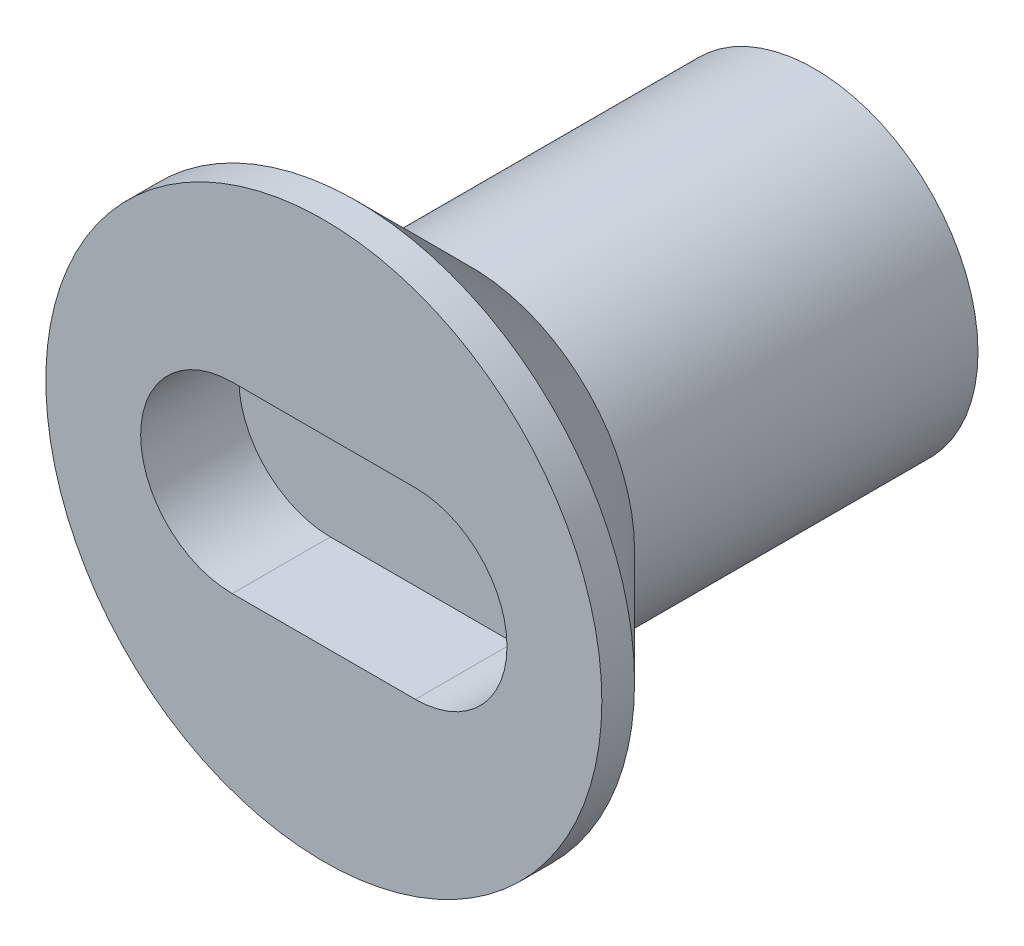
ISO-10303-21;
HEADER;
FILE_DESCRIPTION(('STEP AP214'),'2;1');
FILE_NAME('part.step','',(''),(''),'','','');
FILE_SCHEMA(('AUTOMOTIVE_DESIGN { 1 0 10303 214 1 1 1 1 }'));
ENDSEC;
DATA;
#1=APPLICATION_CONTEXT('core data for automotive mechanical design processes');
#2=APPLICATION_PROTOCOL_DEFINITION('international standard','automotive_design',2000,#1);
#3=PRODUCT_CONTEXT('',#1,'mechanical');
#4=PRODUCT('Part','Part','',(#3));
#5=PRODUCT_RELATED_PRODUCT_CATEGORY('part','',(#4));
#6=PRODUCT_DEFINITION_FORMATION('','',#4);
#7=PRODUCT_DEFINITION_CONTEXT('part definition',#1,'design');
#8=PRODUCT_DEFINITION('design','',#6,#7);
#9=PRODUCT_DEFINITION_SHAPE('','',#8);
#10=(LENGTH_UNIT() NAMED_UNIT(*) SI_UNIT(.MILLI.,.METRE.));
#11=(NAMED_UNIT(*) PLANE_ANGLE_UNIT() SI_UNIT($,.RADIAN.));
#12=(NAMED_UNIT(*) SI_UNIT($,.STERADIAN.) SOLID_ANGLE_UNIT());
#13=UNCERTAINTY_MEASURE_WITH_UNIT(LENGTH_MEASURE(1.E-05),#10,'distance_accuracy_value','');
#14=(GEOMETRIC_REPRESENTATION_CONTEXT(3) GLOBAL_UNCERTAINTY_ASSIGNED_CONTEXT((#13)) GLOBAL_UNIT_ASSIGNED_CONTEXT((#10,
#11,#12)) REPRESENTATION_CONTEXT('',''));
#15=CARTESIAN_POINT('',(0.,0.,0.));
#16=DIRECTION('',(0.,0.,1.));
#17=DIRECTION('',(1.,0.,0.));
#18=AXIS2_PLACEMENT_3D('',#15,#16,#17);
#19=CARTESIAN_POINT('',(0.,0.,15.));
#20=DIRECTION('',(0.,0.,1.));
#21=DIRECTION('',(1.,0.,0.));
#22=AXIS2_PLACEMENT_3D('',#19,#20,#21);
#23=PLANE('',#22);
#24=CARTESIAN_POINT('',(0.,0.,15.));
#25=DIRECTION('',(0.,0.,1.));
#26=DIRECTION('',(1.,0.,0.));
#27=AXIS2_PLACEMENT_3D('',#24,#25,#26);
#28=CIRCLE('',#27,8.5);
#29=CARTESIAN_POINT('',(8.5,0.,15.));
#30=VERTEX_POINT('',#29);
#31=EDGE_CURVE('E118',#30,#30,#28,.T.);
#32=ORIENTED_EDGE('',*,*,#31,.T.);
#33=EDGE_LOOP('',(#32));
#34=FACE_BOUND('',#33,.T.);
#35=CARTESIAN_POINT('',(-2.8,0.,15.));
#36=DIRECTION('',(0.,0.,1.));
#37=DIRECTION('',(1.,0.,0.));
#38=AXIS2_PLACEMENT_3D('',#35,#36,#37);
#39=CIRCLE('',#38,2.8);
#40=CARTESIAN_POINT('',(-2.8,2.8,15.));
#41=VERTEX_POINT('',#40);
#42=CARTESIAN_POINT('',(-2.8,-2.8,15.));
#43=VERTEX_POINT('',#42);
#44=EDGE_CURVE('E113',#41,#43,#39,.T.);
#45=ORIENTED_EDGE('',*,*,#44,.F.);
#46=DIRECTION('',(1.,0.,0.));
#47=VECTOR('',#46,1.);
#48=CARTESIAN_POINT('',(-2.8,2.8,15.));
#49=LINE('',#48,#47);
#50=CARTESIAN_POINT('',(2.8,2.8,15.));
#51=VERTEX_POINT('',#50);
#52=EDGE_CURVE('E56',#41,#51,#49,.T.);
#53=ORIENTED_EDGE('',*,*,#52,.T.);
#54=CARTESIAN_POINT('',(2.8,0.,15.));
#55=DIRECTION('',(0.,0.,1.));
#56=DIRECTION('',(1.,0.,0.));
#57=AXIS2_PLACEMENT_3D('',#54,#55,#56);
#58=CIRCLE('',#57,2.8);
#59=CARTESIAN_POINT('',(2.8,-2.8,15.));
#60=VERTEX_POINT('',#59);
#61=EDGE_CURVE('E110',#60,#51,#58,.T.);
#62=ORIENTED_EDGE('',*,*,#61,.F.);
#63=DIRECTION('',(1.,0.,0.));
#64=VECTOR('',#63,1.);
#65=CARTESIAN_POINT('',(-2.8,-2.8,15.));
#66=LINE('',#65,#64);
#67=EDGE_CURVE('E91',#43,#60,#66,.T.);
#68=ORIENTED_EDGE('',*,*,#67,.F.);
#69=EDGE_LOOP('',(#45,#53,#62,#68));
#70=FACE_BOUND('',#69,.T.);
#71=ADVANCED_FACE('F40',(#34,#70),#23,.T.);
#72=CARTESIAN_POINT('',(0.,0.,10.));
#73=DIRECTION('',(0.,0.,-1.));
#74=DIRECTION('',(-1.,0.,0.));
#75=AXIS2_PLACEMENT_3D('',#72,#73,#74);
#76=CYLINDRICAL_SURFACE('',#75,5.);
#77=CARTESIAN_POINT('',(0.,0.,10.5));
#78=DIRECTION('',(0.,0.,1.));
#79=DIRECTION('',(1.,0.,0.));
#80=AXIS2_PLACEMENT_3D('',#77,#78,#79);
#81=CIRCLE('',#80,5.);
#82=CARTESIAN_POINT('',(5.,0.,10.5));
#83=VERTEX_POINT('',#82);
#84=EDGE_CURVE('E11',#83,#83,#81,.F.);
#85=ORIENTED_EDGE('',*,*,#84,.T.);
#86=EDGE_LOOP('',(#85));
#87=FACE_BOUND('',#86,.T.);
#88=CARTESIAN_POINT('',(0.,0.,0.));
#89=DIRECTION('',(0.,0.,1.));
#90=DIRECTION('',(1.,0.,0.));
#91=AXIS2_PLACEMENT_3D('',#88,#89,#90);
#92=CIRCLE('',#91,5.);
#93=CARTESIAN_POINT('',(5.,0.,0.));
#94=VERTEX_POINT('',#93);
#95=EDGE_CURVE('E121',#94,#94,#92,.T.);
#96=ORIENTED_EDGE('',*,*,#95,.T.);
#97=EDGE_LOOP('',(#96));
#98=FACE_BOUND('',#97,.T.);
#99=ADVANCED_FACE('F139',(#87,#98),#76,.T.);
#100=CARTESIAN_POINT('',(0.,0.,0.));
#101=DIRECTION('',(0.,0.,1.));
#102=DIRECTION('',(1.,0.,0.));
#103=AXIS2_PLACEMENT_3D('',#100,#101,#102);
#104=PLANE('',#103);
#105=ORIENTED_EDGE('',*,*,#95,.F.);
#106=EDGE_LOOP('',(#105));
#107=FACE_BOUND('',#106,.T.);
#108=ADVANCED_FACE('F147',(#107),#104,.F.);
#109=CARTESIAN_POINT('',(0.,0.,15.));
#110=DIRECTION('',(0.,0.,-1.));
#111=DIRECTION('',(-1.,0.,0.));
#112=AXIS2_PLACEMENT_3D('',#109,#110,#111);
#113=CYLINDRICAL_SURFACE('',#112,8.5);
#114=CARTESIAN_POINT('',(0.,0.,14.0000000000001));
#115=DIRECTION('',(0.,0.,1.));
#116=DIRECTION('',(1.,0.,0.));
#117=AXIS2_PLACEMENT_3D('',#114,#115,#116);
#118=CIRCLE('',#117,8.5);
#119=CARTESIAN_POINT('',(8.5,0.,14.0000000000001));
#120=VERTEX_POINT('',#119);
#121=EDGE_CURVE('E49',#120,#120,#118,.T.);
#122=ORIENTED_EDGE('',*,*,#121,.T.);
#123=EDGE_LOOP('',(#122));
#124=FACE_BOUND('',#123,.T.);
#125=ORIENTED_EDGE('',*,*,#31,.F.);
#126=EDGE_LOOP('',(#125));
#127=FACE_BOUND('',#126,.T.);
#128=ADVANCED_FACE('F126',(#124,#127),#113,.T.);
#129=CARTESIAN_POINT('',(-2.8,2.8,12.));
#130=DIRECTION('',(0.,-1.,0.));
#131=DIRECTION('',(1.,0.,0.));
#132=AXIS2_PLACEMENT_3D('',#129,#130,#131);
#133=PLANE('',#132);
#134=ORIENTED_EDGE('',*,*,#52,.F.);
#135=DIRECTION('',(0.,0.,1.));
#136=VECTOR('',#135,1.);
#137=CARTESIAN_POINT('',(-2.8,2.8,12.));
#138=LINE('',#137,#136);
#139=CARTESIAN_POINT('',(-2.8,2.8,12.));
#140=VERTEX_POINT('',#139);
#141=EDGE_CURVE('E61',#140,#41,#138,.T.);
#142=ORIENTED_EDGE('',*,*,#141,.F.);
#143=DIRECTION('',(1.,0.,0.));
#144=VECTOR('',#143,1.);
#145=CARTESIAN_POINT('',(-2.8,2.8,12.));
#146=LINE('',#145,#144);
#147=CARTESIAN_POINT('',(2.8,2.8,12.));
#148=VERTEX_POINT('',#147);
#149=EDGE_CURVE('E81',#140,#148,#146,.T.);
#150=ORIENTED_EDGE('',*,*,#149,.T.);
#151=DIRECTION('',(0.,0.,1.));
#152=VECTOR('',#151,1.);
#153=CARTESIAN_POINT('',(2.8,2.8,12.));
#154=LINE('',#153,#152);
#155=EDGE_CURVE('E95',#148,#51,#154,.T.);
#156=ORIENTED_EDGE('',*,*,#155,.T.);
#157=EDGE_LOOP('',(#134,#142,#150,#156));
#158=FACE_BOUND('',#157,.T.);
#159=ADVANCED_FACE('F152',(#158),#133,.T.);
#160=CARTESIAN_POINT('',(2.8,0.,12.));
#161=DIRECTION('',(0.,0.,1.));
#162=DIRECTION('',(1.,0.,0.));
#163=AXIS2_PLACEMENT_3D('',#160,#161,#162);
#164=CYLINDRICAL_SURFACE('',#163,2.8);
#165=ORIENTED_EDGE('',*,*,#61,.T.);
#166=ORIENTED_EDGE('',*,*,#155,.F.);
#167=CARTESIAN_POINT('',(2.8,0.,12.));
#168=DIRECTION('',(0.,0.,1.));
#169=DIRECTION('',(1.,0.,0.));
#170=AXIS2_PLACEMENT_3D('',#167,#168,#169);
#171=CIRCLE('',#170,2.8);
#172=CARTESIAN_POINT('',(2.8,-2.8,12.));
#173=VERTEX_POINT('',#172);
#174=EDGE_CURVE('E98',#173,#148,#171,.T.);
#175=ORIENTED_EDGE('',*,*,#174,.F.);
#176=DIRECTION('',(0.,0.,1.));
#177=VECTOR('',#176,1.);
#178=CARTESIAN_POINT('',(2.8,-2.8,12.));
#179=LINE('',#178,#177);
#180=EDGE_CURVE('E84',#173,#60,#179,.T.);
#181=ORIENTED_EDGE('',*,*,#180,.T.);
#182=EDGE_LOOP('',(#165,#166,#175,#181));
#183=FACE_BOUND('',#182,.T.);
#184=ADVANCED_FACE('F99',(#183),#164,.F.);
#185=CARTESIAN_POINT('',(-2.8,-2.8,12.));
#186=DIRECTION('',(0.,-1.,0.));
#187=DIRECTION('',(1.,0.,0.));
#188=AXIS2_PLACEMENT_3D('',#185,#186,#187);
#189=PLANE('',#188);
#190=ORIENTED_EDGE('',*,*,#67,.T.);
#191=ORIENTED_EDGE('',*,*,#180,.F.);
#192=DIRECTION('',(1.,0.,0.));
#193=VECTOR('',#192,1.);
#194=CARTESIAN_POINT('',(-2.8,-2.8,12.));
#195=LINE('',#194,#193);
#196=CARTESIAN_POINT('',(-2.8,-2.8,12.));
#197=VERTEX_POINT('',#196);
#198=EDGE_CURVE('E88',#197,#173,#195,.T.);
#199=ORIENTED_EDGE('',*,*,#198,.F.);
#200=DIRECTION('',(0.,0.,1.));
#201=VECTOR('',#200,1.);
#202=CARTESIAN_POINT('',(-2.8,-2.8,12.));
#203=LINE('',#202,#201);
#204=EDGE_CURVE('E78',#197,#43,#203,.T.);
#205=ORIENTED_EDGE('',*,*,#204,.T.);
#206=EDGE_LOOP('',(#190,#191,#199,#205));
#207=FACE_BOUND('',#206,.T.);
#208=ADVANCED_FACE('F86',(#207),#189,.F.);
#209=CARTESIAN_POINT('',(-2.8,0.,12.));
#210=DIRECTION('',(0.,0.,1.));
#211=DIRECTION('',(1.,0.,0.));
#212=AXIS2_PLACEMENT_3D('',#209,#210,#211);
#213=CYLINDRICAL_SURFACE('',#212,2.8);
#214=ORIENTED_EDGE('',*,*,#44,.T.);
#215=ORIENTED_EDGE('',*,*,#204,.F.);
#216=CARTESIAN_POINT('',(-2.8,0.,12.));
#217=DIRECTION('',(0.,0.,1.));
#218=DIRECTION('',(1.,0.,0.));
#219=AXIS2_PLACEMENT_3D('',#216,#217,#218);
#220=CIRCLE('',#219,2.8);
#221=EDGE_CURVE('E104',#140,#197,#220,.T.);
#222=ORIENTED_EDGE('',*,*,#221,.F.);
#223=ORIENTED_EDGE('',*,*,#141,.T.);
#224=EDGE_LOOP('',(#214,#215,#222,#223));
#225=FACE_BOUND('',#224,.T.);
#226=ADVANCED_FACE('F135',(#225),#213,.F.);
#227=CARTESIAN_POINT('',(2.8,0.,12.));
#228=DIRECTION('',(0.,0.,1.));
#229=DIRECTION('',(1.,0.,0.));
#230=AXIS2_PLACEMENT_3D('',#227,#228,#229);
#231=PLANE('',#230);
#232=ORIENTED_EDGE('',*,*,#149,.F.);
#233=ORIENTED_EDGE('',*,*,#221,.T.);
#234=ORIENTED_EDGE('',*,*,#198,.T.);
#235=ORIENTED_EDGE('',*,*,#174,.T.);
#236=EDGE_LOOP('',(#232,#233,#234,#235));
#237=FACE_BOUND('',#236,.T.);
#238=ADVANCED_FACE('F102',(#237),#231,.T.);
#239=CARTESIAN_POINT('',(0.,0.,14.0000000000001));
#240=DIRECTION('',(0.,0.,1.));
#241=DIRECTION('',(1.,0.,0.));
#242=AXIS2_PLACEMENT_3D('',#239,#240,#241);
#243=CONICAL_SURFACE('',#242,8.5,0.785398163397443);
#244=ORIENTED_EDGE('',*,*,#84,.F.);
#245=EDGE_LOOP('',(#244));
#246=FACE_BOUND('',#245,.T.);
#247=ORIENTED_EDGE('',*,*,#121,.F.);
#248=EDGE_LOOP('',(#247));
#249=FACE_BOUND('',#248,.T.);
#250=ADVANCED_FACE('F43',(#246,#249),#243,.T.);
#251=CLOSED_SHELL('',(#71,#99,#108,#128,#159,#184,#208,#226,#238,#250));
#252=MANIFOLD_SOLID_BREP('B2',#251);
#253=ADVANCED_BREP_SHAPE_REPRESENTATION('',(#18,#252),#14);
#254=SHAPE_DEFINITION_REPRESENTATION(#9,#253);
ENDSEC;
END-ISO-10303-21;
